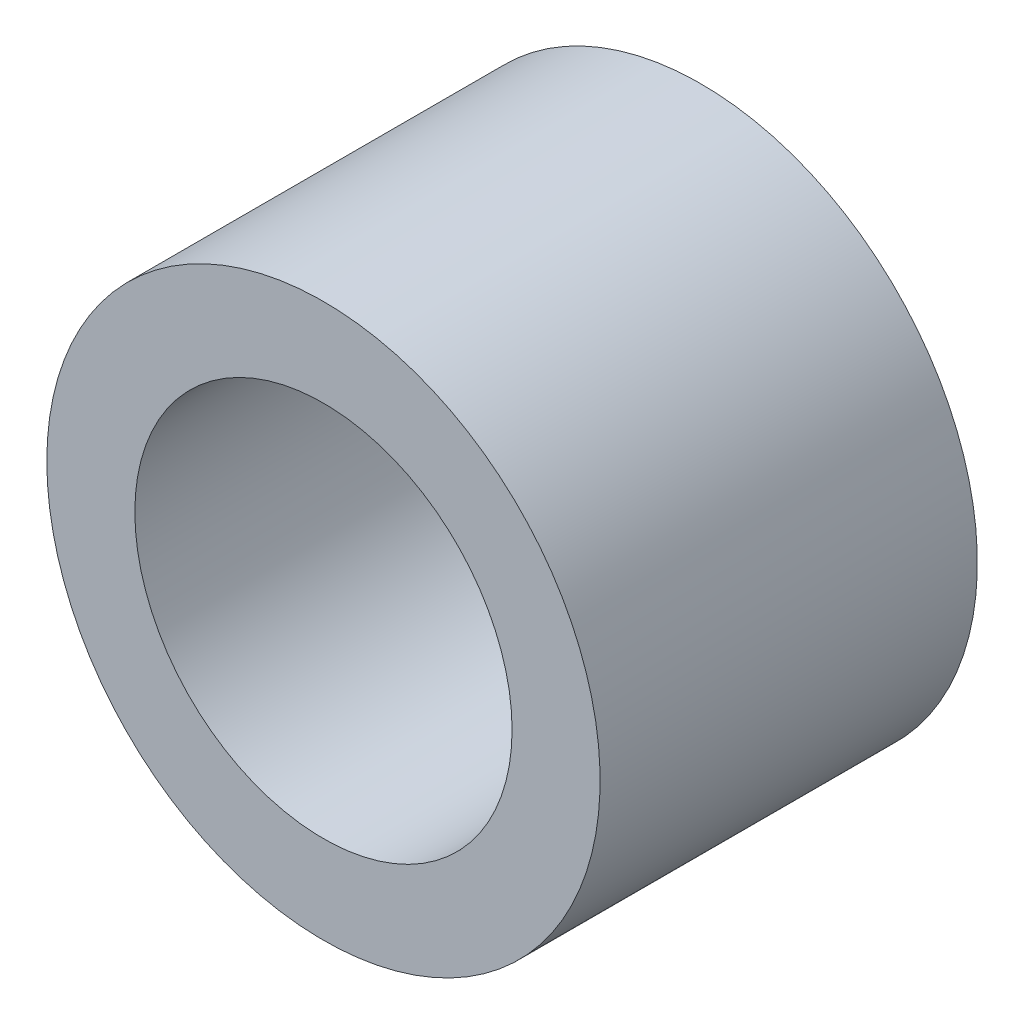
ISO-10303-21;
HEADER;
FILE_DESCRIPTION(('STEP AP214'),'2;1');
FILE_NAME('part.step','',(''),(''),'','','');
FILE_SCHEMA(('AUTOMOTIVE_DESIGN { 1 0 10303 214 1 1 1 1 }'));
ENDSEC;
DATA;
#1=APPLICATION_CONTEXT('core data for automotive mechanical design processes');
#2=APPLICATION_PROTOCOL_DEFINITION('international standard','automotive_design',2000,#1);
#3=PRODUCT_CONTEXT('',#1,'mechanical');
#4=PRODUCT('Part','Part','',(#3));
#5=PRODUCT_RELATED_PRODUCT_CATEGORY('part','',(#4));
#6=PRODUCT_DEFINITION_FORMATION('','',#4);
#7=PRODUCT_DEFINITION_CONTEXT('part definition',#1,'design');
#8=PRODUCT_DEFINITION('design','',#6,#7);
#9=PRODUCT_DEFINITION_SHAPE('','',#8);
#10=(LENGTH_UNIT() NAMED_UNIT(*) SI_UNIT(.MILLI.,.METRE.));
#11=(NAMED_UNIT(*) PLANE_ANGLE_UNIT() SI_UNIT($,.RADIAN.));
#12=(NAMED_UNIT(*) SI_UNIT($,.STERADIAN.) SOLID_ANGLE_UNIT());
#13=UNCERTAINTY_MEASURE_WITH_UNIT(LENGTH_MEASURE(1.E-05),#10,'distance_accuracy_value','');
#14=(GEOMETRIC_REPRESENTATION_CONTEXT(3) GLOBAL_UNCERTAINTY_ASSIGNED_CONTEXT((#13)) GLOBAL_UNIT_ASSIGNED_CONTEXT((#10,
#11,#12)) REPRESENTATION_CONTEXT('',''));
#15=CARTESIAN_POINT('',(0.,0.,0.));
#16=DIRECTION('',(0.,0.,1.));
#17=DIRECTION('',(1.,0.,0.));
#18=AXIS2_PLACEMENT_3D('',#15,#16,#17);
#19=CARTESIAN_POINT('',(0.,0.,7.62));
#20=DIRECTION('',(0.,0.,1.));
#21=DIRECTION('',(1.,0.,0.));
#22=AXIS2_PLACEMENT_3D('',#19,#20,#21);
#23=PLANE('',#22);
#24=CARTESIAN_POINT('',(0.,0.,7.62));
#25=DIRECTION('',(0.,0.,1.));
#26=DIRECTION('',(1.,0.,0.));
#27=AXIS2_PLACEMENT_3D('',#24,#25,#26);
#28=CIRCLE('',#27,5.588);
#29=CARTESIAN_POINT('',(-5.588,0.,7.62));
#30=VERTEX_POINT('',#29);
#31=EDGE_CURVE('E10',#30,#30,#28,.T.);
#32=ORIENTED_EDGE('',*,*,#31,.T.);
#33=EDGE_LOOP('',(#32));
#34=FACE_BOUND('',#33,.T.);
#35=CARTESIAN_POINT('',(0.,0.,7.62));
#36=DIRECTION('',(0.,0.,1.));
#37=DIRECTION('',(1.,0.,0.));
#38=AXIS2_PLACEMENT_3D('',#35,#36,#37);
#39=CIRCLE('',#38,3.81);
#40=CARTESIAN_POINT('',(-3.81,0.,7.62));
#41=VERTEX_POINT('',#40);
#42=EDGE_CURVE('E50',#41,#41,#39,.T.);
#43=ORIENTED_EDGE('',*,*,#42,.F.);
#44=EDGE_LOOP('',(#43));
#45=FACE_BOUND('',#44,.T.);
#46=ADVANCED_FACE('F37',(#34,#45),#23,.T.);
#47=CARTESIAN_POINT('',(0.,0.,0.));
#48=DIRECTION('',(0.,0.,1.));
#49=DIRECTION('',(1.,0.,0.));
#50=AXIS2_PLACEMENT_3D('',#47,#48,#49);
#51=PLANE('',#50);
#52=CARTESIAN_POINT('',(0.,0.,0.));
#53=DIRECTION('',(0.,0.,1.));
#54=DIRECTION('',(1.,0.,0.));
#55=AXIS2_PLACEMENT_3D('',#52,#53,#54);
#56=CIRCLE('',#55,5.588);
#57=CARTESIAN_POINT('',(-5.588,0.,0.));
#58=VERTEX_POINT('',#57);
#59=EDGE_CURVE('E41',#58,#58,#56,.T.);
#60=ORIENTED_EDGE('',*,*,#59,.F.);
#61=EDGE_LOOP('',(#60));
#62=FACE_BOUND('',#61,.T.);
#63=CARTESIAN_POINT('',(0.,0.,0.));
#64=DIRECTION('',(0.,0.,1.));
#65=DIRECTION('',(1.,0.,0.));
#66=AXIS2_PLACEMENT_3D('',#63,#64,#65);
#67=CIRCLE('',#66,3.81);
#68=CARTESIAN_POINT('',(-3.81,0.,0.));
#69=VERTEX_POINT('',#68);
#70=EDGE_CURVE('E52',#69,#69,#67,.T.);
#71=ORIENTED_EDGE('',*,*,#70,.T.);
#72=EDGE_LOOP('',(#71));
#73=FACE_BOUND('',#72,.T.);
#74=ADVANCED_FACE('F64',(#62,#73),#51,.F.);
#75=CARTESIAN_POINT('',(0.,0.,7.62));
#76=DIRECTION('',(0.,0.,-1.));
#77=DIRECTION('',(-1.,0.,0.));
#78=AXIS2_PLACEMENT_3D('',#75,#76,#77);
#79=CYLINDRICAL_SURFACE('',#78,5.588);
#80=CARTESIAN_POINT('',(-5.588,0.,7.62));
#81=CARTESIAN_POINT('',(-5.588,0.,7.540625));
#82=CARTESIAN_POINT('',(-5.588,0.,7.46125));
#83=CARTESIAN_POINT('',(-5.588,0.,7.3025));
#84=CARTESIAN_POINT('',(-5.588,0.,7.223125));
#85=CARTESIAN_POINT('',(-5.588,0.,7.064375));
#86=CARTESIAN_POINT('',(-5.588,0.,6.985));
#87=CARTESIAN_POINT('',(-5.588,0.,6.82625));
#88=CARTESIAN_POINT('',(-5.588,0.,6.746875));
#89=CARTESIAN_POINT('',(-5.588,0.,6.588125));
#90=CARTESIAN_POINT('',(-5.588,0.,6.50875));
#91=CARTESIAN_POINT('',(-5.588,0.,6.35));
#92=CARTESIAN_POINT('',(-5.588,0.,6.270625));
#93=CARTESIAN_POINT('',(-5.588,0.,6.111875));
#94=CARTESIAN_POINT('',(-5.588,0.,6.0325));
#95=CARTESIAN_POINT('',(-5.588,0.,5.87375));
#96=CARTESIAN_POINT('',(-5.588,0.,5.794375));
#97=CARTESIAN_POINT('',(-5.588,0.,5.635625));
#98=CARTESIAN_POINT('',(-5.588,0.,5.55625));
#99=CARTESIAN_POINT('',(-5.588,0.,5.3975));
#100=CARTESIAN_POINT('',(-5.588,0.,5.318125));
#101=CARTESIAN_POINT('',(-5.588,0.,5.159375));
#102=CARTESIAN_POINT('',(-5.588,0.,5.08));
#103=CARTESIAN_POINT('',(-5.588,0.,4.92125));
#104=CARTESIAN_POINT('',(-5.588,0.,4.841875));
#105=CARTESIAN_POINT('',(-5.588,0.,4.683125));
#106=CARTESIAN_POINT('',(-5.588,0.,4.60375));
#107=CARTESIAN_POINT('',(-5.588,0.,4.445));
#108=CARTESIAN_POINT('',(-5.588,0.,4.365625));
#109=CARTESIAN_POINT('',(-5.588,0.,4.206875));
#110=CARTESIAN_POINT('',(-5.588,0.,4.1275));
#111=CARTESIAN_POINT('',(-5.588,0.,3.96875));
#112=CARTESIAN_POINT('',(-5.588,0.,3.889375));
#113=CARTESIAN_POINT('',(-5.588,0.,3.730625));
#114=CARTESIAN_POINT('',(-5.588,0.,3.65125));
#115=CARTESIAN_POINT('',(-5.588,0.,3.4925));
#116=CARTESIAN_POINT('',(-5.588,0.,3.413125));
#117=CARTESIAN_POINT('',(-5.588,0.,3.254375));
#118=CARTESIAN_POINT('',(-5.588,0.,3.175));
#119=CARTESIAN_POINT('',(-5.588,0.,3.01625));
#120=CARTESIAN_POINT('',(-5.588,0.,2.936875));
#121=CARTESIAN_POINT('',(-5.588,0.,2.778125));
#122=CARTESIAN_POINT('',(-5.588,0.,2.69875));
#123=CARTESIAN_POINT('',(-5.588,0.,2.54));
#124=CARTESIAN_POINT('',(-5.588,0.,2.460625));
#125=CARTESIAN_POINT('',(-5.588,0.,2.301875));
#126=CARTESIAN_POINT('',(-5.588,0.,2.2225));
#127=CARTESIAN_POINT('',(-5.588,0.,2.06375));
#128=CARTESIAN_POINT('',(-5.588,0.,1.984375));
#129=CARTESIAN_POINT('',(-5.588,0.,1.825625));
#130=CARTESIAN_POINT('',(-5.588,0.,1.74625));
#131=CARTESIAN_POINT('',(-5.588,0.,1.5875));
#132=CARTESIAN_POINT('',(-5.588,0.,1.508125));
#133=CARTESIAN_POINT('',(-5.588,0.,1.349375));
#134=CARTESIAN_POINT('',(-5.588,0.,1.27));
#135=CARTESIAN_POINT('',(-5.588,0.,1.11125));
#136=CARTESIAN_POINT('',(-5.588,0.,1.031875));
#137=CARTESIAN_POINT('',(-5.588,0.,0.873125));
#138=CARTESIAN_POINT('',(-5.588,0.,0.79375));
#139=CARTESIAN_POINT('',(-5.588,0.,0.635));
#140=CARTESIAN_POINT('',(-5.588,0.,0.555625));
#141=CARTESIAN_POINT('',(-5.588,0.,0.396875));
#142=CARTESIAN_POINT('',(-5.588,0.,0.3175));
#143=CARTESIAN_POINT('',(-5.588,0.,0.15875));
#144=CARTESIAN_POINT('',(-5.588,0.,0.0793749999999999));
#145=CARTESIAN_POINT('',(-5.588,0.,0.));
#146=B_SPLINE_CURVE_WITH_KNOTS('',3,(#80,#81,#82,#83,#84,#85,#86,#87,#88,#89,#90,#91,#92,#93,
#94,#95,#96,#97,#98,#99,#100,#101,#102,#103,#104,#105,#106,#107,#108,#109,#110,#111,#112,#113,
#114,#115,#116,#117,#118,#119,#120,#121,#122,#123,#124,#125,#126,#127,#128,#129,#130,#131,#132,
#133,#134,#135,#136,#137,#138,#139,#140,#141,#142,#143,#144,#145),.UNSPECIFIED.,.F.,.F.,(4,2,2,
2,2,2,2,2,2,2,2,2,2,2,2,2,2,2,2,2,2,2,2,2,2,2,2,2,2,2,2,2,4),(0.,0.238125,0.47625,
0.714375000000001,0.9525,1.190625,1.42875,1.666875,1.905,2.143125,2.38125,2.619375,2.8575,
3.095625,3.33375,3.571875,3.81,4.048125,4.28625,4.524375,4.7625,5.000625,5.23875,5.476875,5.715,
5.953125,6.19125,6.429375,6.6675,6.905625,7.14375,7.381875,7.62),.UNSPECIFIED.);
#147=EDGE_CURVE('BSEAM39',#30,#58,#146,.T.);
#148=ORIENTED_EDGE('',*,*,#31,.F.);
#149=ORIENTED_EDGE('',*,*,#59,.T.);
#150=ORIENTED_EDGE('',*,*,#147,.T.);
#151=ORIENTED_EDGE('',*,*,#147,.F.);
#152=EDGE_LOOP('',(#148,#150,#149,#151));
#153=FACE_BOUND('',#152,.T.);
#154=ADVANCED_FACE('F39',(#153),#79,.T.);
#155=CARTESIAN_POINT('',(0.,0.,7.62));
#156=DIRECTION('',(0.,0.,-1.));
#157=DIRECTION('',(-1.,0.,0.));
#158=AXIS2_PLACEMENT_3D('',#155,#156,#157);
#159=CYLINDRICAL_SURFACE('',#158,3.81);
#160=CARTESIAN_POINT('',(-3.81,0.,7.62));
#161=CARTESIAN_POINT('',(-3.81,0.,7.540625));
#162=CARTESIAN_POINT('',(-3.81,0.,7.46125));
#163=CARTESIAN_POINT('',(-3.81,0.,7.3025));
#164=CARTESIAN_POINT('',(-3.81,0.,7.223125));
#165=CARTESIAN_POINT('',(-3.81,0.,7.064375));
#166=CARTESIAN_POINT('',(-3.81,0.,6.985));
#167=CARTESIAN_POINT('',(-3.81,0.,6.82625));
#168=CARTESIAN_POINT('',(-3.81,0.,6.746875));
#169=CARTESIAN_POINT('',(-3.81,0.,6.588125));
#170=CARTESIAN_POINT('',(-3.81,0.,6.50875));
#171=CARTESIAN_POINT('',(-3.81,0.,6.35));
#172=CARTESIAN_POINT('',(-3.81,0.,6.270625));
#173=CARTESIAN_POINT('',(-3.81,0.,6.111875));
#174=CARTESIAN_POINT('',(-3.81,0.,6.0325));
#175=CARTESIAN_POINT('',(-3.81,0.,5.87375));
#176=CARTESIAN_POINT('',(-3.81,0.,5.794375));
#177=CARTESIAN_POINT('',(-3.81,0.,5.635625));
#178=CARTESIAN_POINT('',(-3.81,0.,5.55625));
#179=CARTESIAN_POINT('',(-3.81,0.,5.3975));
#180=CARTESIAN_POINT('',(-3.81,0.,5.318125));
#181=CARTESIAN_POINT('',(-3.81,0.,5.159375));
#182=CARTESIAN_POINT('',(-3.81,0.,5.08));
#183=CARTESIAN_POINT('',(-3.81,0.,4.92125));
#184=CARTESIAN_POINT('',(-3.81,0.,4.841875));
#185=CARTESIAN_POINT('',(-3.81,0.,4.683125));
#186=CARTESIAN_POINT('',(-3.81,0.,4.60375));
#187=CARTESIAN_POINT('',(-3.81,0.,4.445));
#188=CARTESIAN_POINT('',(-3.81,0.,4.365625));
#189=CARTESIAN_POINT('',(-3.81,0.,4.206875));
#190=CARTESIAN_POINT('',(-3.81,0.,4.1275));
#191=CARTESIAN_POINT('',(-3.81,0.,3.96875));
#192=CARTESIAN_POINT('',(-3.81,0.,3.889375));
#193=CARTESIAN_POINT('',(-3.81,0.,3.730625));
#194=CARTESIAN_POINT('',(-3.81,0.,3.65125));
#195=CARTESIAN_POINT('',(-3.81,0.,3.4925));
#196=CARTESIAN_POINT('',(-3.81,0.,3.413125));
#197=CARTESIAN_POINT('',(-3.81,0.,3.254375));
#198=CARTESIAN_POINT('',(-3.81,0.,3.175));
#199=CARTESIAN_POINT('',(-3.81,0.,3.01625));
#200=CARTESIAN_POINT('',(-3.81,0.,2.936875));
#201=CARTESIAN_POINT('',(-3.81,0.,2.778125));
#202=CARTESIAN_POINT('',(-3.81,0.,2.69875));
#203=CARTESIAN_POINT('',(-3.81,0.,2.54));
#204=CARTESIAN_POINT('',(-3.81,0.,2.460625));
#205=CARTESIAN_POINT('',(-3.81,0.,2.301875));
#206=CARTESIAN_POINT('',(-3.81,0.,2.2225));
#207=CARTESIAN_POINT('',(-3.81,0.,2.06375));
#208=CARTESIAN_POINT('',(-3.81,0.,1.984375));
#209=CARTESIAN_POINT('',(-3.81,0.,1.825625));
#210=CARTESIAN_POINT('',(-3.81,0.,1.74625));
#211=CARTESIAN_POINT('',(-3.81,0.,1.5875));
#212=CARTESIAN_POINT('',(-3.81,0.,1.508125));
#213=CARTESIAN_POINT('',(-3.81,0.,1.349375));
#214=CARTESIAN_POINT('',(-3.81,0.,1.27));
#215=CARTESIAN_POINT('',(-3.81,0.,1.11125));
#216=CARTESIAN_POINT('',(-3.81,0.,1.031875));
#217=CARTESIAN_POINT('',(-3.81,0.,0.873125));
#218=CARTESIAN_POINT('',(-3.81,0.,0.79375));
#219=CARTESIAN_POINT('',(-3.81,0.,0.635));
#220=CARTESIAN_POINT('',(-3.81,0.,0.555625));
#221=CARTESIAN_POINT('',(-3.81,0.,0.396875));
#222=CARTESIAN_POINT('',(-3.81,0.,0.3175));
#223=CARTESIAN_POINT('',(-3.81,0.,0.15875));
#224=CARTESIAN_POINT('',(-3.81,0.,0.0793749999999999));
#225=CARTESIAN_POINT('',(-3.81,0.,0.));
#226=B_SPLINE_CURVE_WITH_KNOTS('',3,(#160,#161,#162,#163,#164,#165,#166,#167,#168,#169,#170,
#171,#172,#173,#174,#175,#176,#177,#178,#179,#180,#181,#182,#183,#184,#185,#186,#187,#188,#189,
#190,#191,#192,#193,#194,#195,#196,#197,#198,#199,#200,#201,#202,#203,#204,#205,#206,#207,#208,
#209,#210,#211,#212,#213,#214,#215,#216,#217,#218,#219,#220,#221,#222,#223,#224,#225),
.UNSPECIFIED.,.F.,.F.,(4,2,2,2,2,2,2,2,2,2,2,2,2,2,2,2,2,2,2,2,2,2,2,2,2,2,2,2,2,2,2,2,4),(0.,
0.238125,0.47625,0.714375000000001,0.9525,1.190625,1.42875,1.666875,1.905,2.143125,2.38125,
2.619375,2.8575,3.095625,3.33375,3.571875,3.81,4.048125,4.28625,4.524375,4.7625,5.000625,
5.23875,5.476875,5.715,5.953125,6.19125,6.429375,6.6675,6.905625,7.14375,7.381875,7.62),.UNSPECIFIED.);
#227=EDGE_CURVE('BSEAM60',#41,#69,#226,.T.);
#228=ORIENTED_EDGE('',*,*,#42,.T.);
#229=ORIENTED_EDGE('',*,*,#70,.F.);
#230=ORIENTED_EDGE('',*,*,#227,.T.);
#231=ORIENTED_EDGE('',*,*,#227,.F.);
#232=EDGE_LOOP('',(#228,#230,#229,#231));
#233=FACE_BOUND('',#232,.T.);
#234=ADVANCED_FACE('F60',(#233),#159,.F.);
#235=CLOSED_SHELL('',(#46,#74,#154,#234));
#236=MANIFOLD_SOLID_BREP('B2',#235);
#237=ADVANCED_BREP_SHAPE_REPRESENTATION('',(#18,#236),#14);
#238=SHAPE_DEFINITION_REPRESENTATION(#9,#237);
ENDSEC;
END-ISO-10303-21;
